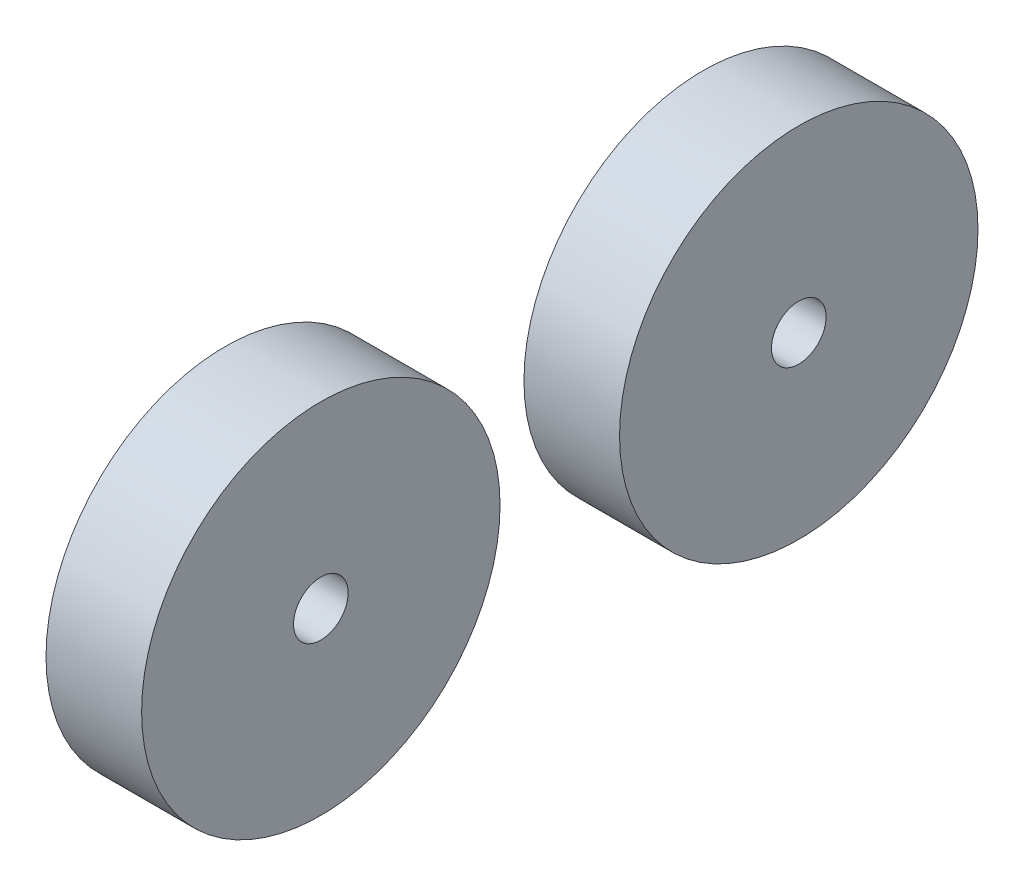
ISO-10303-21;
HEADER;
FILE_DESCRIPTION(('STEP AP214'),'2;1');
FILE_NAME('part.step','',(''),(''),'','','');
FILE_SCHEMA(('AUTOMOTIVE_DESIGN { 1 0 10303 214 1 1 1 1 }'));
ENDSEC;
DATA;
#1=APPLICATION_CONTEXT('core data for automotive mechanical design processes');
#2=APPLICATION_PROTOCOL_DEFINITION('international standard','automotive_design',2000,#1);
#3=PRODUCT_CONTEXT('',#1,'mechanical');
#4=PRODUCT('Part','Part','',(#3));
#5=PRODUCT_RELATED_PRODUCT_CATEGORY('part','',(#4));
#6=PRODUCT_DEFINITION_FORMATION('','',#4);
#7=PRODUCT_DEFINITION_CONTEXT('part definition',#1,'design');
#8=PRODUCT_DEFINITION('design','',#6,#7);
#9=PRODUCT_DEFINITION_SHAPE('','',#8);
#10=(LENGTH_UNIT() NAMED_UNIT(*) SI_UNIT(.MILLI.,.METRE.));
#11=(NAMED_UNIT(*) PLANE_ANGLE_UNIT() SI_UNIT($,.RADIAN.));
#12=(NAMED_UNIT(*) SI_UNIT($,.STERADIAN.) SOLID_ANGLE_UNIT());
#13=UNCERTAINTY_MEASURE_WITH_UNIT(LENGTH_MEASURE(1.E-05),#10,'distance_accuracy_value','');
#14=(GEOMETRIC_REPRESENTATION_CONTEXT(3) GLOBAL_UNCERTAINTY_ASSIGNED_CONTEXT((#13)) GLOBAL_UNIT_ASSIGNED_CONTEXT((#10,
#11,#12)) REPRESENTATION_CONTEXT('',''));
#15=CARTESIAN_POINT('',(0.,0.,0.));
#16=DIRECTION('',(0.,0.,1.));
#17=DIRECTION('',(1.,0.,0.));
#18=AXIS2_PLACEMENT_3D('',#15,#16,#17);
#19=CARTESIAN_POINT('',(8.,0.,-20.));
#20=DIRECTION('',(-1.,0.,0.));
#21=DIRECTION('',(0.,0.,1.));
#22=AXIS2_PLACEMENT_3D('',#19,#20,#21);
#23=CYLINDRICAL_SURFACE('',#22,2.286);
#24=CARTESIAN_POINT('',(8.,0.,-20.));
#25=DIRECTION('',(1.,0.,0.));
#26=DIRECTION('',(0.,0.,-1.));
#27=AXIS2_PLACEMENT_3D('',#24,#25,#26);
#28=CIRCLE('',#27,2.286);
#29=CARTESIAN_POINT('',(8.,0.,-22.286));
#30=VERTEX_POINT('',#29);
#31=EDGE_CURVE('E48',#30,#30,#28,.T.);
#32=ORIENTED_EDGE('',*,*,#31,.T.);
#33=EDGE_LOOP('',(#32));
#34=FACE_BOUND('',#33,.T.);
#35=CARTESIAN_POINT('',(0.,0.,-20.));
#36=DIRECTION('',(1.,0.,0.));
#37=DIRECTION('',(0.,0.,-1.));
#38=AXIS2_PLACEMENT_3D('',#35,#36,#37);
#39=CIRCLE('',#38,2.286);
#40=CARTESIAN_POINT('',(0.,0.,-22.286));
#41=VERTEX_POINT('',#40);
#42=EDGE_CURVE('E54',#41,#41,#39,.T.);
#43=ORIENTED_EDGE('',*,*,#42,.F.);
#44=EDGE_LOOP('',(#43));
#45=FACE_BOUND('',#44,.T.);
#46=ADVANCED_FACE('F41',(#34,#45),#23,.F.);
#47=CARTESIAN_POINT('',(8.,0.,-20.));
#48=DIRECTION('',(-1.,0.,0.));
#49=DIRECTION('',(0.,0.,1.));
#50=AXIS2_PLACEMENT_3D('',#47,#48,#49);
#51=CYLINDRICAL_SURFACE('',#50,15.);
#52=CARTESIAN_POINT('',(8.,0.,-20.));
#53=DIRECTION('',(1.,0.,0.));
#54=DIRECTION('',(0.,0.,-1.));
#55=AXIS2_PLACEMENT_3D('',#52,#53,#54);
#56=CIRCLE('',#55,15.);
#57=CARTESIAN_POINT('',(8.,0.,-35.));
#58=VERTEX_POINT('',#57);
#59=EDGE_CURVE('E11',#58,#58,#56,.T.);
#60=ORIENTED_EDGE('',*,*,#59,.F.);
#61=EDGE_LOOP('',(#60));
#62=FACE_BOUND('',#61,.T.);
#63=CARTESIAN_POINT('',(0.,0.,-20.));
#64=DIRECTION('',(1.,0.,0.));
#65=DIRECTION('',(0.,0.,-1.));
#66=AXIS2_PLACEMENT_3D('',#63,#64,#65);
#67=CIRCLE('',#66,15.);
#68=CARTESIAN_POINT('',(0.,0.,-35.));
#69=VERTEX_POINT('',#68);
#70=EDGE_CURVE('E44',#69,#69,#67,.T.);
#71=ORIENTED_EDGE('',*,*,#70,.T.);
#72=EDGE_LOOP('',(#71));
#73=FACE_BOUND('',#72,.T.);
#74=ADVANCED_FACE('F61',(#62,#73),#51,.T.);
#75=CARTESIAN_POINT('',(8.,0.,0.));
#76=DIRECTION('',(1.,0.,0.));
#77=DIRECTION('',(0.,0.,-1.));
#78=AXIS2_PLACEMENT_3D('',#75,#76,#77);
#79=PLANE('',#78);
#80=ORIENTED_EDGE('',*,*,#31,.F.);
#81=EDGE_LOOP('',(#80));
#82=FACE_BOUND('',#81,.T.);
#83=ORIENTED_EDGE('',*,*,#59,.T.);
#84=EDGE_LOOP('',(#83));
#85=FACE_BOUND('',#84,.T.);
#86=ADVANCED_FACE('F65',(#82,#85),#79,.T.);
#87=CARTESIAN_POINT('',(0.,0.,0.));
#88=DIRECTION('',(1.,0.,0.));
#89=DIRECTION('',(0.,0.,-1.));
#90=AXIS2_PLACEMENT_3D('',#87,#88,#89);
#91=PLANE('',#90);
#92=ORIENTED_EDGE('',*,*,#42,.T.);
#93=EDGE_LOOP('',(#92));
#94=FACE_BOUND('',#93,.T.);
#95=ORIENTED_EDGE('',*,*,#70,.F.);
#96=EDGE_LOOP('',(#95));
#97=FACE_BOUND('',#96,.T.);
#98=ADVANCED_FACE('F63',(#94,#97),#91,.F.);
#99=CLOSED_SHELL('',(#46,#74,#86,#98));
#100=MANIFOLD_SOLID_BREP('B2',#99);
#101=CARTESIAN_POINT('',(8.,0.,20.));
#102=DIRECTION('',(-1.,0.,0.));
#103=DIRECTION('',(0.,0.,1.));
#104=AXIS2_PLACEMENT_3D('',#101,#102,#103);
#105=CYLINDRICAL_SURFACE('',#104,15.);
#106=CARTESIAN_POINT('',(8.,0.,20.));
#107=DIRECTION('',(1.,0.,0.));
#108=DIRECTION('',(0.,0.,-1.));
#109=AXIS2_PLACEMENT_3D('',#106,#107,#108);
#110=CIRCLE('',#109,15.);
#111=CARTESIAN_POINT('',(8.,0.,5.));
#112=VERTEX_POINT('',#111);
#113=EDGE_CURVE('E110',#112,#112,#110,.T.);
#114=ORIENTED_EDGE('',*,*,#113,.F.);
#115=EDGE_LOOP('',(#114));
#116=FACE_BOUND('',#115,.T.);
#117=CARTESIAN_POINT('',(0.,0.,20.));
#118=DIRECTION('',(1.,0.,0.));
#119=DIRECTION('',(0.,0.,-1.));
#120=AXIS2_PLACEMENT_3D('',#117,#118,#119);
#121=CIRCLE('',#120,15.);
#122=CARTESIAN_POINT('',(0.,0.,5.));
#123=VERTEX_POINT('',#122);
#124=EDGE_CURVE('E116',#123,#123,#121,.T.);
#125=ORIENTED_EDGE('',*,*,#124,.T.);
#126=EDGE_LOOP('',(#125));
#127=FACE_BOUND('',#126,.T.);
#128=ADVANCED_FACE('F103',(#116,#127),#105,.T.);
#129=CARTESIAN_POINT('',(8.,0.,20.));
#130=DIRECTION('',(-1.,0.,0.));
#131=DIRECTION('',(0.,0.,1.));
#132=AXIS2_PLACEMENT_3D('',#129,#130,#131);
#133=CYLINDRICAL_SURFACE('',#132,2.286);
#134=CARTESIAN_POINT('',(8.,0.,20.));
#135=DIRECTION('',(1.,0.,0.));
#136=DIRECTION('',(0.,0.,-1.));
#137=AXIS2_PLACEMENT_3D('',#134,#135,#136);
#138=CIRCLE('',#137,2.286);
#139=CARTESIAN_POINT('',(8.,0.,17.714));
#140=VERTEX_POINT('',#139);
#141=EDGE_CURVE('E40',#140,#140,#138,.T.);
#142=ORIENTED_EDGE('',*,*,#141,.T.);
#143=EDGE_LOOP('',(#142));
#144=FACE_BOUND('',#143,.T.);
#145=CARTESIAN_POINT('',(0.,0.,20.));
#146=DIRECTION('',(1.,0.,0.));
#147=DIRECTION('',(0.,0.,-1.));
#148=AXIS2_PLACEMENT_3D('',#145,#146,#147);
#149=CIRCLE('',#148,2.286);
#150=CARTESIAN_POINT('',(0.,0.,17.714));
#151=VERTEX_POINT('',#150);
#152=EDGE_CURVE('E106',#151,#151,#149,.T.);
#153=ORIENTED_EDGE('',*,*,#152,.F.);
#154=EDGE_LOOP('',(#153));
#155=FACE_BOUND('',#154,.T.);
#156=ADVANCED_FACE('F125',(#144,#155),#133,.F.);
#157=CARTESIAN_POINT('',(8.,0.,0.));
#158=DIRECTION('',(1.,0.,0.));
#159=DIRECTION('',(0.,0.,-1.));
#160=AXIS2_PLACEMENT_3D('',#157,#158,#159);
#161=PLANE('',#160);
#162=ORIENTED_EDGE('',*,*,#113,.T.);
#163=EDGE_LOOP('',(#162));
#164=FACE_BOUND('',#163,.T.);
#165=ORIENTED_EDGE('',*,*,#141,.F.);
#166=EDGE_LOOP('',(#165));
#167=FACE_BOUND('',#166,.T.);
#168=ADVANCED_FACE('F127',(#164,#167),#161,.T.);
#169=CARTESIAN_POINT('',(0.,0.,0.));
#170=DIRECTION('',(1.,0.,0.));
#171=DIRECTION('',(0.,0.,-1.));
#172=AXIS2_PLACEMENT_3D('',#169,#170,#171);
#173=PLANE('',#172);
#174=ORIENTED_EDGE('',*,*,#124,.F.);
#175=EDGE_LOOP('',(#174));
#176=FACE_BOUND('',#175,.T.);
#177=ORIENTED_EDGE('',*,*,#152,.T.);
#178=EDGE_LOOP('',(#177));
#179=FACE_BOUND('',#178,.T.);
#180=ADVANCED_FACE('F123',(#176,#179),#173,.F.);
#181=CLOSED_SHELL('',(#128,#156,#168,#180));
#182=MANIFOLD_SOLID_BREP('B6',#181);
#183=ADVANCED_BREP_SHAPE_REPRESENTATION('',(#18,#100,#182),#14);
#184=SHAPE_DEFINITION_REPRESENTATION(#9,#183);
ENDSEC;
END-ISO-10303-21;
